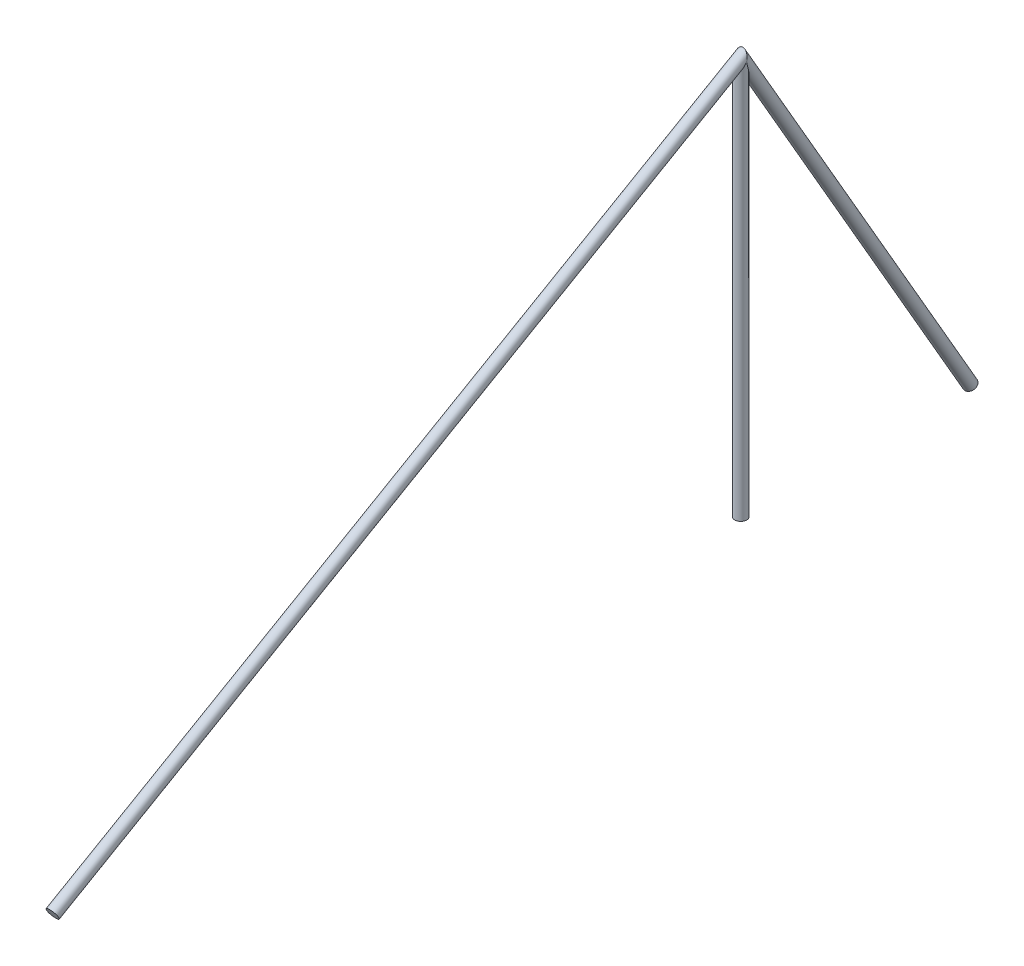
ISO-10303-21;
HEADER;
FILE_DESCRIPTION(('STEP AP214'),'2;1');
FILE_NAME('part.step','',(''),(''),'','','');
FILE_SCHEMA(('AUTOMOTIVE_DESIGN { 1 0 10303 214 1 1 1 1 }'));
ENDSEC;
DATA;
#1=APPLICATION_CONTEXT('core data for automotive mechanical design processes');
#2=APPLICATION_PROTOCOL_DEFINITION('international standard','automotive_design',2000,#1);
#3=PRODUCT_CONTEXT('',#1,'mechanical');
#4=PRODUCT('Part','Part','',(#3));
#5=PRODUCT_RELATED_PRODUCT_CATEGORY('part','',(#4));
#6=PRODUCT_DEFINITION_FORMATION('','',#4);
#7=PRODUCT_DEFINITION_CONTEXT('part definition',#1,'design');
#8=PRODUCT_DEFINITION('design','',#6,#7);
#9=PRODUCT_DEFINITION_SHAPE('','',#8);
#10=(LENGTH_UNIT() NAMED_UNIT(*) SI_UNIT(.MILLI.,.METRE.));
#11=(NAMED_UNIT(*) PLANE_ANGLE_UNIT() SI_UNIT($,.RADIAN.));
#12=(NAMED_UNIT(*) SI_UNIT($,.STERADIAN.) SOLID_ANGLE_UNIT());
#13=UNCERTAINTY_MEASURE_WITH_UNIT(LENGTH_MEASURE(1.E-05),#10,'distance_accuracy_value','');
#14=(GEOMETRIC_REPRESENTATION_CONTEXT(3) GLOBAL_UNCERTAINTY_ASSIGNED_CONTEXT((#13)) GLOBAL_UNIT_ASSIGNED_CONTEXT((#10,
#11,#12)) REPRESENTATION_CONTEXT('',''));
#15=CARTESIAN_POINT('',(0.,0.,0.));
#16=DIRECTION('',(0.,0.,1.));
#17=DIRECTION('',(1.,0.,0.));
#18=AXIS2_PLACEMENT_3D('',#15,#16,#17);
#19=CARTESIAN_POINT('',(0.,-2540.,-3.11060286983428E-13));
#20=DIRECTION('',(0.,1.,0.));
#21=DIRECTION('',(0.,0.,1.));
#22=AXIS2_PLACEMENT_3D('',#19,#20,#21);
#23=CYLINDRICAL_SURFACE('',#22,38.1);
#24=CARTESIAN_POINT('',(0.,-2540.,-3.11060286983428E-13));
#25=DIRECTION('',(0.,-1.,0.));
#26=DIRECTION('',(0.,0.,-1.));
#27=AXIS2_PLACEMENT_3D('',#24,#25,#26);
#28=CIRCLE('',#27,38.1);
#29=CARTESIAN_POINT('',(0.,-2540.,-38.1000000000003));
#30=VERTEX_POINT('',#29);
#31=EDGE_CURVE('E82',#30,#30,#28,.T.);
#32=ORIENTED_EDGE('',*,*,#31,.F.);
#33=EDGE_LOOP('',(#32));
#34=FACE_BOUND('',#33,.T.);
#35=CARTESIAN_POINT('',(0.,6.66133814775094E-13,2.22044604925031E-13));
#36=DIRECTION('',(0.,0.258819045102521,-0.965925826289068));
#37=DIRECTION('',(0.,0.965925826289068,0.258819045102522));
#38=AXIS2_PLACEMENT_3D('',#35,#36,#37);
#39=ELLIPSE('',#38,147.207095926454,38.1);
#40=CARTESIAN_POINT('',(38.1,-2.88444402957534E-13,0.));
#41=VERTEX_POINT('',#40);
#42=CARTESIAN_POINT('',(-38.1,-2.77555756156289E-13,0.));
#43=VERTEX_POINT('',#42);
#44=EDGE_CURVE('E81',#41,#43,#39,.T.);
#45=ORIENTED_EDGE('',*,*,#44,.F.);
#46=CARTESIAN_POINT('',(0.,-2.77555756156289E-13,0.));
#47=DIRECTION('',(0.,0.500000000000001,0.866025403784438));
#48=DIRECTION('',(0.,0.866025403784438,-0.500000000000001));
#49=AXIS2_PLACEMENT_3D('',#46,#47,#48);
#50=ELLIPSE('',#49,76.1999999999998,38.1);
#51=EDGE_CURVE('E13',#43,#41,#50,.T.);
#52=ORIENTED_EDGE('',*,*,#51,.F.);
#53=EDGE_LOOP('',(#45,#52));
#54=FACE_BOUND('',#53,.T.);
#55=ADVANCED_FACE('F61',(#34,#54),#23,.T.);
#56=CARTESIAN_POINT('',(0.,-2540.,-3.11060286983428E-13));
#57=DIRECTION('',(0.,-1.,0.));
#58=DIRECTION('',(0.,0.,-1.));
#59=AXIS2_PLACEMENT_3D('',#56,#57,#58);
#60=PLANE('',#59);
#61=ORIENTED_EDGE('',*,*,#31,.T.);
#62=EDGE_LOOP('',(#61));
#63=FACE_BOUND('',#62,.T.);
#64=ADVANCED_FACE('F87',(#63),#60,.T.);
#65=CARTESIAN_POINT('',(0.,-2540.,-1466.46968374165));
#66=DIRECTION('',(0.,0.866025403784438,0.500000000000001));
#67=DIRECTION('',(0.,-0.500000000000001,0.866025403784438));
#68=AXIS2_PLACEMENT_3D('',#65,#66,#67);
#69=CYLINDRICAL_SURFACE('',#68,38.1);
#70=ORIENTED_EDGE('',*,*,#44,.T.);
#71=CARTESIAN_POINT('',(0.,0.,0.));
#72=DIRECTION('',(0.,0.258819045102521,0.965925826289068));
#73=DIRECTION('',(0.,0.965925826289068,-0.258819045102521));
#74=AXIS2_PLACEMENT_3D('',#71,#72,#73);
#75=ELLIPSE('',#74,53.8815367264148,38.1);
#76=EDGE_CURVE('E65',#43,#41,#75,.T.);
#77=ORIENTED_EDGE('',*,*,#76,.T.);
#78=EDGE_LOOP('',(#70,#77));
#79=FACE_BOUND('',#78,.T.);
#80=ADVANCED_FACE('F63',(#79),#69,.F.);
#81=CARTESIAN_POINT('',(0.,0.,0.));
#82=DIRECTION('',(0.,-0.499999999999998,0.86602540378444));
#83=DIRECTION('',(0.,-0.86602540378444,-0.499999999999998));
#84=AXIS2_PLACEMENT_3D('',#81,#82,#83);
#85=CYLINDRICAL_SURFACE('',#84,38.1);
#86=ORIENTED_EDGE('',*,*,#51,.T.);
#87=ORIENTED_EDGE('',*,*,#76,.F.);
#88=EDGE_LOOP('',(#86,#87));
#89=FACE_BOUND('',#88,.T.);
#90=ADVANCED_FACE('F77',(#89),#85,.F.);
#91=CLOSED_SHELL('',(#55,#64,#80,#90));
#92=MANIFOLD_SOLID_BREP('B2',#91);
#93=CARTESIAN_POINT('',(0.,0.,0.));
#94=DIRECTION('',(0.,-0.499999999999998,0.86602540378444));
#95=DIRECTION('',(0.,-0.86602540378444,-0.499999999999998));
#96=AXIS2_PLACEMENT_3D('',#93,#94,#95);
#97=CYLINDRICAL_SURFACE('',#96,38.1);
#98=CARTESIAN_POINT('',(0.,-2540.,4399.40905122497));
#99=DIRECTION('',(0.,0.499999999999998,-0.86602540378444));
#100=DIRECTION('',(0.,0.86602540378444,0.499999999999998));
#101=AXIS2_PLACEMENT_3D('',#98,#99,#100);
#102=CIRCLE('',#101,38.1);
#103=CARTESIAN_POINT('',(0.,-2507.00443211581,4418.45905122497));
#104=VERTEX_POINT('',#103);
#105=EDGE_CURVE('E168',#104,#104,#102,.T.);
#106=ORIENTED_EDGE('',*,*,#105,.T.);
#107=EDGE_LOOP('',(#106));
#108=FACE_BOUND('',#107,.T.);
#109=CARTESIAN_POINT('',(0.,0.,0.));
#110=DIRECTION('',(0.,-0.258819045102521,-0.965925826289068));
#111=DIRECTION('',(0.,-0.965925826289068,0.258819045102521));
#112=AXIS2_PLACEMENT_3D('',#109,#110,#111);
#113=ELLIPSE('',#112,53.8815367264148,38.1);
#114=CARTESIAN_POINT('',(0.,-52.045567884187,13.9455678841871));
#115=VERTEX_POINT('',#114);
#116=EDGE_CURVE('E60',#115,#115,#113,.T.);
#117=ORIENTED_EDGE('',*,*,#116,.F.);
#118=EDGE_LOOP('',(#117));
#119=FACE_BOUND('',#118,.T.);
#120=ADVANCED_FACE('F160',(#108,#119),#97,.T.);
#121=CARTESIAN_POINT('',(0.,-2540.,4399.40905122497));
#122=DIRECTION('',(0.,0.499999999999998,-0.86602540378444));
#123=DIRECTION('',(0.,0.86602540378444,0.499999999999998));
#124=AXIS2_PLACEMENT_3D('',#121,#122,#123);
#125=PLANE('',#124);
#126=ORIENTED_EDGE('',*,*,#105,.F.);
#127=EDGE_LOOP('',(#126));
#128=FACE_BOUND('',#127,.T.);
#129=ADVANCED_FACE('F177',(#128),#125,.F.);
#130=CARTESIAN_POINT('',(0.,0.,0.));
#131=DIRECTION('',(0.,-0.258819045102521,-0.965925826289068));
#132=DIRECTION('',(0.,0.965925826289068,-0.258819045102521));
#133=AXIS2_PLACEMENT_3D('',#130,#131,#132);
#134=PLANE('',#133);
#135=ORIENTED_EDGE('',*,*,#116,.T.);
#136=EDGE_LOOP('',(#135));
#137=FACE_BOUND('',#136,.T.);
#138=ADVANCED_FACE('F162',(#137),#134,.T.);
#139=CLOSED_SHELL('',(#120,#129,#138));
#140=MANIFOLD_SOLID_BREP('B7',#139);
#141=CARTESIAN_POINT('',(0.,-2540.,-1466.46968374165));
#142=DIRECTION('',(0.,0.866025403784438,0.500000000000001));
#143=DIRECTION('',(0.,-0.500000000000001,0.866025403784438));
#144=AXIS2_PLACEMENT_3D('',#141,#142,#143);
#145=CYLINDRICAL_SURFACE('',#144,38.1);
#146=CARTESIAN_POINT('',(0.,-2540.,-1466.46968374165));
#147=DIRECTION('',(0.,-0.866025403784438,-0.500000000000001));
#148=DIRECTION('',(0.,0.500000000000001,-0.866025403784438));
#149=AXIS2_PLACEMENT_3D('',#146,#147,#148);
#150=CIRCLE('',#149,38.1);
#151=CARTESIAN_POINT('',(0.,-2520.95,-1499.46525162584));
#152=VERTEX_POINT('',#151);
#153=EDGE_CURVE('E237',#152,#152,#150,.T.);
#154=ORIENTED_EDGE('',*,*,#153,.F.);
#155=EDGE_LOOP('',(#154));
#156=FACE_BOUND('',#155,.T.);
#157=CARTESIAN_POINT('',(0.,0.,0.));
#158=DIRECTION('',(0.,0.258819045102521,0.965925826289068));
#159=DIRECTION('',(0.,0.965925826289068,-0.258819045102521));
#160=AXIS2_PLACEMENT_3D('',#157,#158,#159);
#161=ELLIPSE('',#160,53.8815367264148,38.1);
#162=CARTESIAN_POINT('',(0.,52.045567884187,-13.9455678841871));
#163=VERTEX_POINT('',#162);
#164=EDGE_CURVE('E159',#163,#163,#161,.T.);
#165=ORIENTED_EDGE('',*,*,#164,.F.);
#166=EDGE_LOOP('',(#165));
#167=FACE_BOUND('',#166,.T.);
#168=ADVANCED_FACE('F230',(#156,#167),#145,.T.);
#169=CARTESIAN_POINT('',(0.,-2540.,-1466.46968374165));
#170=DIRECTION('',(0.,-0.866025403784438,-0.500000000000001));
#171=DIRECTION('',(0.,0.500000000000001,-0.866025403784438));
#172=AXIS2_PLACEMENT_3D('',#169,#170,#171);
#173=PLANE('',#172);
#174=ORIENTED_EDGE('',*,*,#153,.T.);
#175=EDGE_LOOP('',(#174));
#176=FACE_BOUND('',#175,.T.);
#177=ADVANCED_FACE('F243',(#176),#173,.T.);
#178=CARTESIAN_POINT('',(0.,0.,0.));
#179=DIRECTION('',(0.,0.258819045102521,0.965925826289068));
#180=DIRECTION('',(0.,-0.965925826289068,0.258819045102521));
#181=AXIS2_PLACEMENT_3D('',#178,#179,#180);
#182=PLANE('',#181);
#183=ORIENTED_EDGE('',*,*,#164,.T.);
#184=EDGE_LOOP('',(#183));
#185=FACE_BOUND('',#184,.T.);
#186=ADVANCED_FACE('F232',(#185),#182,.T.);
#187=CLOSED_SHELL('',(#168,#177,#186));
#188=MANIFOLD_SOLID_BREP('B55',#187);
#189=ADVANCED_BREP_SHAPE_REPRESENTATION('',(#18,#92,#140,#188),#14);
#190=SHAPE_DEFINITION_REPRESENTATION(#9,#189);
ENDSEC;
END-ISO-10303-21;
